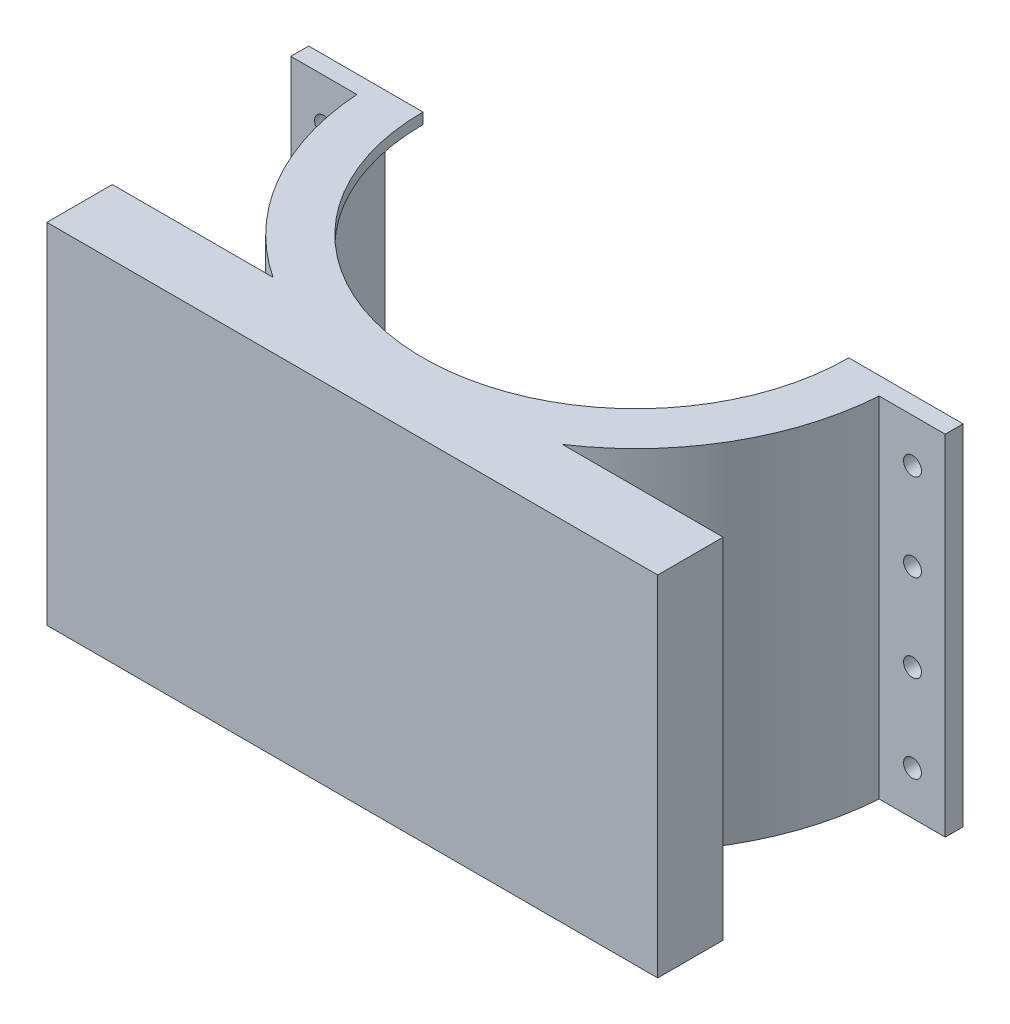
ISO-10303-21;
HEADER;
FILE_DESCRIPTION(('STEP AP214'),'2;1');
FILE_NAME('part.step','',(''),(''),'','','');
FILE_SCHEMA(('AUTOMOTIVE_DESIGN { 1 0 10303 214 1 1 1 1 }'));
ENDSEC;
DATA;
#1=APPLICATION_CONTEXT('core data for automotive mechanical design processes');
#2=APPLICATION_PROTOCOL_DEFINITION('international standard','automotive_design',2000,#1);
#3=PRODUCT_CONTEXT('',#1,'mechanical');
#4=PRODUCT('Part','Part','',(#3));
#5=PRODUCT_RELATED_PRODUCT_CATEGORY('part','',(#4));
#6=PRODUCT_DEFINITION_FORMATION('','',#4);
#7=PRODUCT_DEFINITION_CONTEXT('part definition',#1,'design');
#8=PRODUCT_DEFINITION('design','',#6,#7);
#9=PRODUCT_DEFINITION_SHAPE('','',#8);
#10=(LENGTH_UNIT() NAMED_UNIT(*) SI_UNIT(.MILLI.,.METRE.));
#11=(NAMED_UNIT(*) PLANE_ANGLE_UNIT() SI_UNIT($,.RADIAN.));
#12=(NAMED_UNIT(*) SI_UNIT($,.STERADIAN.) SOLID_ANGLE_UNIT());
#13=UNCERTAINTY_MEASURE_WITH_UNIT(LENGTH_MEASURE(1.E-05),#10,'distance_accuracy_value','');
#14=(GEOMETRIC_REPRESENTATION_CONTEXT(3) GLOBAL_UNCERTAINTY_ASSIGNED_CONTEXT((#13)) GLOBAL_UNIT_ASSIGNED_CONTEXT((#10,
#11,#12)) REPRESENTATION_CONTEXT('',''));
#15=CARTESIAN_POINT('',(0.,0.,0.));
#16=DIRECTION('',(0.,0.,1.));
#17=DIRECTION('',(1.,0.,0.));
#18=AXIS2_PLACEMENT_3D('',#15,#16,#17);
#19=CARTESIAN_POINT('',(0.,4.,0.));
#20=DIRECTION('',(0.,0.,-1.));
#21=DIRECTION('',(-1.,0.,0.));
#22=AXIS2_PLACEMENT_3D('',#19,#20,#21);
#23=PLANE('',#22);
#24=CARTESIAN_POINT('',(6.75,-3.,0.));
#25=DIRECTION('',(0.,0.,-1.));
#26=DIRECTION('',(-1.,0.,0.));
#27=AXIS2_PLACEMENT_3D('',#24,#25,#26);
#28=CIRCLE('',#27,0.205000000000001);
#29=CARTESIAN_POINT('',(6.545,-3.,0.));
#30=VERTEX_POINT('',#29);
#31=EDGE_CURVE('E176',#30,#30,#28,.T.);
#32=ORIENTED_EDGE('',*,*,#31,.F.);
#33=EDGE_LOOP('',(#32));
#34=FACE_BOUND('',#33,.T.);
#35=CARTESIAN_POINT('',(6.75,-0.999999999999998,0.));
#36=DIRECTION('',(0.,0.,-1.));
#37=DIRECTION('',(-1.,0.,0.));
#38=AXIS2_PLACEMENT_3D('',#35,#36,#37);
#39=CIRCLE('',#38,0.205000000000001);
#40=CARTESIAN_POINT('',(6.545,-0.999999999999998,0.));
#41=VERTEX_POINT('',#40);
#42=EDGE_CURVE('E359',#41,#41,#39,.T.);
#43=ORIENTED_EDGE('',*,*,#42,.F.);
#44=EDGE_LOOP('',(#43));
#45=FACE_BOUND('',#44,.T.);
#46=CARTESIAN_POINT('',(6.75,1.,0.));
#47=DIRECTION('',(0.,0.,-1.));
#48=DIRECTION('',(-1.,0.,0.));
#49=AXIS2_PLACEMENT_3D('',#46,#47,#48);
#50=CIRCLE('',#49,0.205000000000001);
#51=CARTESIAN_POINT('',(6.545,1.,0.));
#52=VERTEX_POINT('',#51);
#53=EDGE_CURVE('E362',#52,#52,#50,.T.);
#54=ORIENTED_EDGE('',*,*,#53,.F.);
#55=EDGE_LOOP('',(#54));
#56=FACE_BOUND('',#55,.T.);
#57=CARTESIAN_POINT('',(6.75,3.,0.));
#58=DIRECTION('',(0.,0.,-1.));
#59=DIRECTION('',(-1.,0.,0.));
#60=AXIS2_PLACEMENT_3D('',#57,#58,#59);
#61=CIRCLE('',#60,0.205000000000001);
#62=CARTESIAN_POINT('',(6.545,3.,0.));
#63=VERTEX_POINT('',#62);
#64=EDGE_CURVE('E365',#63,#63,#61,.T.);
#65=ORIENTED_EDGE('',*,*,#64,.F.);
#66=EDGE_LOOP('',(#65));
#67=FACE_BOUND('',#66,.T.);
#68=DIRECTION('',(1.,0.,0.));
#69=VECTOR('',#68,1.);
#70=CARTESIAN_POINT('',(0.,3.75,0.));
#71=LINE('',#70,#69);
#72=CARTESIAN_POINT('',(4.88,3.75,0.));
#73=VERTEX_POINT('',#72);
#74=CARTESIAN_POINT('',(5.75,3.75,0.));
#75=VERTEX_POINT('',#74);
#76=EDGE_CURVE('E175',#73,#75,#71,.T.);
#77=ORIENTED_EDGE('',*,*,#76,.F.);
#78=DIRECTION('',(0.,-1.,0.));
#79=VECTOR('',#78,1.);
#80=CARTESIAN_POINT('',(4.88,7.5,0.));
#81=LINE('',#80,#79);
#82=CARTESIAN_POINT('',(4.88,4.,0.));
#83=VERTEX_POINT('',#82);
#84=EDGE_CURVE('E51',#83,#73,#81,.T.);
#85=ORIENTED_EDGE('',*,*,#84,.F.);
#86=DIRECTION('',(1.,0.,0.));
#87=VECTOR('',#86,1.);
#88=CARTESIAN_POINT('',(0.,4.,0.));
#89=LINE('',#88,#87);
#90=CARTESIAN_POINT('',(7.5,4.,0.));
#91=VERTEX_POINT('',#90);
#92=EDGE_CURVE('E172',#83,#91,#89,.T.);
#93=ORIENTED_EDGE('',*,*,#92,.T.);
#94=DIRECTION('',(0.,-1.,0.));
#95=VECTOR('',#94,1.);
#96=CARTESIAN_POINT('',(7.5,4.,0.));
#97=LINE('',#96,#95);
#98=CARTESIAN_POINT('',(7.5,-4.,0.));
#99=VERTEX_POINT('',#98);
#100=EDGE_CURVE('E265',#91,#99,#97,.T.);
#101=ORIENTED_EDGE('',*,*,#100,.T.);
#102=DIRECTION('',(1.,0.,0.));
#103=VECTOR('',#102,1.);
#104=CARTESIAN_POINT('',(0.,-4.,0.));
#105=LINE('',#104,#103);
#106=CARTESIAN_POINT('',(1.5,-4.,0.));
#107=VERTEX_POINT('',#106);
#108=EDGE_CURVE('E218',#107,#99,#105,.T.);
#109=ORIENTED_EDGE('',*,*,#108,.F.);
#110=DIRECTION('',(0.,-1.,0.));
#111=VECTOR('',#110,1.);
#112=CARTESIAN_POINT('',(1.5,4.,0.));
#113=LINE('',#112,#111);
#114=CARTESIAN_POINT('',(1.5,-3.75,0.));
#115=VERTEX_POINT('',#114);
#116=EDGE_CURVE('E263',#115,#107,#113,.T.);
#117=ORIENTED_EDGE('',*,*,#116,.F.);
#118=DIRECTION('',(1.,0.,0.));
#119=VECTOR('',#118,1.);
#120=CARTESIAN_POINT('',(0.,-3.75,0.));
#121=LINE('',#120,#119);
#122=CARTESIAN_POINT('',(5.75,-3.75,0.));
#123=VERTEX_POINT('',#122);
#124=EDGE_CURVE('E344',#115,#123,#121,.T.);
#125=ORIENTED_EDGE('',*,*,#124,.T.);
#126=DIRECTION('',(0.,1.,0.));
#127=VECTOR('',#126,1.);
#128=CARTESIAN_POINT('',(5.75,-3.75,0.));
#129=LINE('',#128,#127);
#130=EDGE_CURVE('E209',#123,#75,#129,.T.);
#131=ORIENTED_EDGE('',*,*,#130,.T.);
#132=EDGE_LOOP('',(#77,#85,#93,#101,#109,#117,#125,#131));
#133=FACE_BOUND('',#132,.T.);
#134=ADVANCED_FACE('F37',(#34,#45,#56,#67,#133),#23,.T.);
#135=CARTESIAN_POINT('',(0.,4.,0.));
#136=DIRECTION('',(0.,0.,-1.));
#137=DIRECTION('',(-1.,0.,0.));
#138=AXIS2_PLACEMENT_3D('',#135,#136,#137);
#139=PLANE('',#138);
#140=CARTESIAN_POINT('',(-6.75,1.,0.));
#141=DIRECTION('',(0.,0.,-1.));
#142=DIRECTION('',(-1.,0.,0.));
#143=AXIS2_PLACEMENT_3D('',#140,#141,#142);
#144=CIRCLE('',#143,0.205000000000001);
#145=CARTESIAN_POINT('',(-6.955,1.,0.));
#146=VERTEX_POINT('',#145);
#147=EDGE_CURVE('E368',#146,#146,#144,.T.);
#148=ORIENTED_EDGE('',*,*,#147,.F.);
#149=EDGE_LOOP('',(#148));
#150=FACE_BOUND('',#149,.T.);
#151=CARTESIAN_POINT('',(-6.75,-1.,0.));
#152=DIRECTION('',(0.,0.,-1.));
#153=DIRECTION('',(-1.,0.,0.));
#154=AXIS2_PLACEMENT_3D('',#151,#152,#153);
#155=CIRCLE('',#154,0.205000000000001);
#156=CARTESIAN_POINT('',(-6.955,-1.,0.));
#157=VERTEX_POINT('',#156);
#158=EDGE_CURVE('E371',#157,#157,#155,.T.);
#159=ORIENTED_EDGE('',*,*,#158,.F.);
#160=EDGE_LOOP('',(#159));
#161=FACE_BOUND('',#160,.T.);
#162=CARTESIAN_POINT('',(-6.75,-3.,0.));
#163=DIRECTION('',(0.,0.,-1.));
#164=DIRECTION('',(-1.,0.,0.));
#165=AXIS2_PLACEMENT_3D('',#162,#163,#164);
#166=CIRCLE('',#165,0.205000000000001);
#167=CARTESIAN_POINT('',(-6.955,-3.,0.));
#168=VERTEX_POINT('',#167);
#169=EDGE_CURVE('E374',#168,#168,#166,.T.);
#170=ORIENTED_EDGE('',*,*,#169,.F.);
#171=EDGE_LOOP('',(#170));
#172=FACE_BOUND('',#171,.T.);
#173=CARTESIAN_POINT('',(-6.75,3.,0.));
#174=DIRECTION('',(0.,0.,-1.));
#175=DIRECTION('',(-1.,0.,0.));
#176=AXIS2_PLACEMENT_3D('',#173,#174,#175);
#177=CIRCLE('',#176,0.205000000000001);
#178=CARTESIAN_POINT('',(-6.955,3.,0.));
#179=VERTEX_POINT('',#178);
#180=EDGE_CURVE('E377',#179,#179,#177,.T.);
#181=ORIENTED_EDGE('',*,*,#180,.F.);
#182=EDGE_LOOP('',(#181));
#183=FACE_BOUND('',#182,.T.);
#184=DIRECTION('',(1.,0.,0.));
#185=VECTOR('',#184,1.);
#186=CARTESIAN_POINT('',(0.,4.,0.));
#187=LINE('',#186,#185);
#188=CARTESIAN_POINT('',(-7.5,4.,0.));
#189=VERTEX_POINT('',#188);
#190=CARTESIAN_POINT('',(-4.88,4.,0.));
#191=VERTEX_POINT('',#190);
#192=EDGE_CURVE('E182',#189,#191,#187,.T.);
#193=ORIENTED_EDGE('',*,*,#192,.T.);
#194=DIRECTION('',(0.,-1.,0.));
#195=VECTOR('',#194,1.);
#196=CARTESIAN_POINT('',(-4.88,7.5,0.));
#197=LINE('',#196,#195);
#198=CARTESIAN_POINT('',(-4.88,3.75,0.));
#199=VERTEX_POINT('',#198);
#200=EDGE_CURVE('E163',#191,#199,#197,.T.);
#201=ORIENTED_EDGE('',*,*,#200,.T.);
#202=DIRECTION('',(1.,0.,0.));
#203=VECTOR('',#202,1.);
#204=CARTESIAN_POINT('',(0.,3.75,0.));
#205=LINE('',#204,#203);
#206=CARTESIAN_POINT('',(-5.75,3.75,0.));
#207=VERTEX_POINT('',#206);
#208=EDGE_CURVE('E168',#207,#199,#205,.T.);
#209=ORIENTED_EDGE('',*,*,#208,.F.);
#210=DIRECTION('',(0.,1.,0.));
#211=VECTOR('',#210,1.);
#212=CARTESIAN_POINT('',(-5.75,-3.75,0.));
#213=LINE('',#212,#211);
#214=CARTESIAN_POINT('',(-5.75,-3.75,0.));
#215=VERTEX_POINT('',#214);
#216=EDGE_CURVE('E342',#215,#207,#213,.T.);
#217=ORIENTED_EDGE('',*,*,#216,.F.);
#218=DIRECTION('',(1.,0.,0.));
#219=VECTOR('',#218,1.);
#220=CARTESIAN_POINT('',(0.,-3.75,0.));
#221=LINE('',#220,#219);
#222=CARTESIAN_POINT('',(-1.5,-3.75,0.));
#223=VERTEX_POINT('',#222);
#224=EDGE_CURVE('E325',#215,#223,#221,.T.);
#225=ORIENTED_EDGE('',*,*,#224,.T.);
#226=DIRECTION('',(0.,-1.,0.));
#227=VECTOR('',#226,1.);
#228=CARTESIAN_POINT('',(-1.5,4.,0.));
#229=LINE('',#228,#227);
#230=CARTESIAN_POINT('',(-1.5,-4.,0.));
#231=VERTEX_POINT('',#230);
#232=EDGE_CURVE('E261',#223,#231,#229,.T.);
#233=ORIENTED_EDGE('',*,*,#232,.T.);
#234=DIRECTION('',(1.,0.,0.));
#235=VECTOR('',#234,1.);
#236=CARTESIAN_POINT('',(0.,-4.,0.));
#237=LINE('',#236,#235);
#238=CARTESIAN_POINT('',(-7.5,-4.,0.));
#239=VERTEX_POINT('',#238);
#240=EDGE_CURVE('E224',#239,#231,#237,.T.);
#241=ORIENTED_EDGE('',*,*,#240,.F.);
#242=DIRECTION('',(0.,-1.,0.));
#243=VECTOR('',#242,1.);
#244=CARTESIAN_POINT('',(-7.5,4.,0.));
#245=LINE('',#244,#243);
#246=EDGE_CURVE('E259',#189,#239,#245,.T.);
#247=ORIENTED_EDGE('',*,*,#246,.F.);
#248=EDGE_LOOP('',(#193,#201,#209,#217,#225,#233,#241,#247));
#249=FACE_BOUND('',#248,.T.);
#250=ADVANCED_FACE('F320',(#150,#161,#172,#183,#249),#139,.T.);
#251=CARTESIAN_POINT('',(0.,4.,0.));
#252=DIRECTION('',(0.,1.,0.));
#253=DIRECTION('',(0.,0.,1.));
#254=AXIS2_PLACEMENT_3D('',#251,#252,#253);
#255=PLANE('',#254);
#256=ORIENTED_EDGE('',*,*,#92,.F.);
#257=CARTESIAN_POINT('',(0.,4.,0.));
#258=DIRECTION('',(0.,1.,0.));
#259=DIRECTION('',(0.,0.,1.));
#260=AXIS2_PLACEMENT_3D('',#257,#258,#259);
#261=CIRCLE('',#260,4.88);
#262=EDGE_CURVE('E160',#83,#191,#261,.F.);
#263=ORIENTED_EDGE('',*,*,#262,.T.);
#264=ORIENTED_EDGE('',*,*,#192,.F.);
#265=DIRECTION('',(0.,0.,1.));
#266=VECTOR('',#265,1.);
#267=CARTESIAN_POINT('',(-7.5,4.,0.));
#268=LINE('',#267,#266);
#269=CARTESIAN_POINT('',(-7.5,4.,0.41));
#270=VERTEX_POINT('',#269);
#271=EDGE_CURVE('E184',#189,#270,#268,.T.);
#272=ORIENTED_EDGE('',*,*,#271,.T.);
#273=DIRECTION('',(1.,0.,0.));
#274=VECTOR('',#273,1.);
#275=CARTESIAN_POINT('',(0.,4.,0.41));
#276=LINE('',#275,#274);
#277=CARTESIAN_POINT('',(-5.98597527559211,4.,0.41));
#278=VERTEX_POINT('',#277);
#279=EDGE_CURVE('E191',#270,#278,#276,.T.);
#280=ORIENTED_EDGE('',*,*,#279,.T.);
#281=CARTESIAN_POINT('',(0.,4.,0.));
#282=DIRECTION('',(0.,1.,0.));
#283=DIRECTION('',(0.,0.,1.));
#284=AXIS2_PLACEMENT_3D('',#281,#282,#283);
#285=CIRCLE('',#284,6.);
#286=CARTESIAN_POINT('',(-3.3166247903554,4.,5.));
#287=VERTEX_POINT('',#286);
#288=EDGE_CURVE('E193',#278,#287,#285,.T.);
#289=ORIENTED_EDGE('',*,*,#288,.T.);
#290=DIRECTION('',(1.,0.,0.));
#291=VECTOR('',#290,1.);
#292=CARTESIAN_POINT('',(0.,4.,5.));
#293=LINE('',#292,#291);
#294=CARTESIAN_POINT('',(-7.,4.,5.));
#295=VERTEX_POINT('',#294);
#296=EDGE_CURVE('E194',#295,#287,#293,.T.);
#297=ORIENTED_EDGE('',*,*,#296,.F.);
#298=DIRECTION('',(0.,0.,1.));
#299=VECTOR('',#298,1.);
#300=CARTESIAN_POINT('',(-7.,4.,0.));
#301=LINE('',#300,#299);
#302=CARTESIAN_POINT('',(-7.,4.,6.5));
#303=VERTEX_POINT('',#302);
#304=EDGE_CURVE('E197',#295,#303,#301,.T.);
#305=ORIENTED_EDGE('',*,*,#304,.T.);
#306=DIRECTION('',(1.,0.,0.));
#307=VECTOR('',#306,1.);
#308=CARTESIAN_POINT('',(0.,4.,6.5));
#309=LINE('',#308,#307);
#310=CARTESIAN_POINT('',(7.,4.,6.5));
#311=VERTEX_POINT('',#310);
#312=EDGE_CURVE('E199',#303,#311,#309,.T.);
#313=ORIENTED_EDGE('',*,*,#312,.T.);
#314=DIRECTION('',(0.,0.,1.));
#315=VECTOR('',#314,1.);
#316=CARTESIAN_POINT('',(7.,4.,0.));
#317=LINE('',#316,#315);
#318=CARTESIAN_POINT('',(7.,4.,5.));
#319=VERTEX_POINT('',#318);
#320=EDGE_CURVE('E201',#319,#311,#317,.T.);
#321=ORIENTED_EDGE('',*,*,#320,.F.);
#322=DIRECTION('',(1.,0.,0.));
#323=VECTOR('',#322,1.);
#324=CARTESIAN_POINT('',(0.,4.,5.));
#325=LINE('',#324,#323);
#326=CARTESIAN_POINT('',(3.3166247903554,4.,5.));
#327=VERTEX_POINT('',#326);
#328=EDGE_CURVE('E242',#327,#319,#325,.T.);
#329=ORIENTED_EDGE('',*,*,#328,.F.);
#330=CARTESIAN_POINT('',(5.98597527559211,4.,0.41));
#331=VERTEX_POINT('',#330);
#332=EDGE_CURVE('E276',#327,#331,#285,.T.);
#333=ORIENTED_EDGE('',*,*,#332,.T.);
#334=DIRECTION('',(1.,0.,0.));
#335=VECTOR('',#334,1.);
#336=CARTESIAN_POINT('',(0.,4.,0.41));
#337=LINE('',#336,#335);
#338=CARTESIAN_POINT('',(7.5,4.,0.41));
#339=VERTEX_POINT('',#338);
#340=EDGE_CURVE('E186',#331,#339,#337,.T.);
#341=ORIENTED_EDGE('',*,*,#340,.T.);
#342=DIRECTION('',(0.,0.,1.));
#343=VECTOR('',#342,1.);
#344=CARTESIAN_POINT('',(7.5,4.,0.));
#345=LINE('',#344,#343);
#346=EDGE_CURVE('E181',#91,#339,#345,.T.);
#347=ORIENTED_EDGE('',*,*,#346,.F.);
#348=EDGE_LOOP('',(#256,#263,#264,#272,#280,#289,#297,#305,#313,#321,#329,#333,#341,#347));
#349=FACE_BOUND('',#348,.T.);
#350=ADVANCED_FACE('F179',(#349),#255,.T.);
#351=CARTESIAN_POINT('',(0.,3.75,0.));
#352=DIRECTION('',(0.,1.,0.));
#353=DIRECTION('',(0.,0.,1.));
#354=AXIS2_PLACEMENT_3D('',#351,#352,#353);
#355=PLANE('',#354);
#356=CARTESIAN_POINT('',(0.,3.75,0.));
#357=DIRECTION('',(0.,1.,0.));
#358=DIRECTION('',(0.,0.,1.));
#359=AXIS2_PLACEMENT_3D('',#356,#357,#358);
#360=CIRCLE('',#359,4.88);
#361=EDGE_CURVE('E11',#73,#199,#360,.F.);
#362=ORIENTED_EDGE('',*,*,#361,.F.);
#363=ORIENTED_EDGE('',*,*,#76,.T.);
#364=CARTESIAN_POINT('',(0.,3.75,0.));
#365=DIRECTION('',(0.,1.,0.));
#366=DIRECTION('',(0.,0.,1.));
#367=AXIS2_PLACEMENT_3D('',#364,#365,#366);
#368=CIRCLE('',#367,5.75);
#369=EDGE_CURVE('E59',#207,#75,#368,.T.);
#370=ORIENTED_EDGE('',*,*,#369,.F.);
#371=ORIENTED_EDGE('',*,*,#208,.T.);
#372=EDGE_LOOP('',(#362,#363,#370,#371));
#373=FACE_BOUND('',#372,.T.);
#374=ADVANCED_FACE('F467',(#373),#355,.F.);
#375=CARTESIAN_POINT('',(0.,4.,0.));
#376=DIRECTION('',(0.,-1.,0.));
#377=DIRECTION('',(0.,0.,-1.));
#378=AXIS2_PLACEMENT_3D('',#375,#376,#377);
#379=CYLINDRICAL_SURFACE('',#378,1.5);
#380=ORIENTED_EDGE('',*,*,#232,.F.);
#381=CARTESIAN_POINT('',(0.,-3.75,0.));
#382=DIRECTION('',(0.,1.,0.));
#383=DIRECTION('',(0.,0.,1.));
#384=AXIS2_PLACEMENT_3D('',#381,#382,#383);
#385=CIRCLE('',#384,1.5);
#386=EDGE_CURVE('E347',#223,#115,#385,.T.);
#387=ORIENTED_EDGE('',*,*,#386,.T.);
#388=ORIENTED_EDGE('',*,*,#116,.T.);
#389=CARTESIAN_POINT('',(0.,-4.,0.));
#390=DIRECTION('',(0.,1.,0.));
#391=DIRECTION('',(0.,0.,1.));
#392=AXIS2_PLACEMENT_3D('',#389,#390,#391);
#393=CIRCLE('',#392,1.5);
#394=EDGE_CURVE('E221',#231,#107,#393,.T.);
#395=ORIENTED_EDGE('',*,*,#394,.F.);
#396=EDGE_LOOP('',(#380,#387,#388,#395));
#397=FACE_BOUND('',#396,.T.);
#398=ADVANCED_FACE('F328',(#397),#379,.F.);
#399=CARTESIAN_POINT('',(0.,4.,5.));
#400=DIRECTION('',(0.,0.,-1.));
#401=DIRECTION('',(-1.,0.,0.));
#402=AXIS2_PLACEMENT_3D('',#399,#400,#401);
#403=PLANE('',#402);
#404=DIRECTION('',(1.,0.,0.));
#405=VECTOR('',#404,1.);
#406=CARTESIAN_POINT('',(0.,-4.,5.));
#407=LINE('',#406,#405);
#408=CARTESIAN_POINT('',(3.3166247903554,-4.,5.));
#409=VERTEX_POINT('',#408);
#410=CARTESIAN_POINT('',(7.,-4.,5.));
#411=VERTEX_POINT('',#410);
#412=EDGE_CURVE('E205',#409,#411,#407,.T.);
#413=ORIENTED_EDGE('',*,*,#412,.F.);
#414=DIRECTION('',(0.,-1.,0.));
#415=VECTOR('',#414,1.);
#416=CARTESIAN_POINT('',(3.3166247903554,4.,5.));
#417=LINE('',#416,#415);
#418=EDGE_CURVE('E45',#327,#409,#417,.T.);
#419=ORIENTED_EDGE('',*,*,#418,.F.);
#420=ORIENTED_EDGE('',*,*,#328,.T.);
#421=DIRECTION('',(0.,-1.,0.));
#422=VECTOR('',#421,1.);
#423=CARTESIAN_POINT('',(7.,4.,5.));
#424=LINE('',#423,#422);
#425=EDGE_CURVE('E204',#319,#411,#424,.T.);
#426=ORIENTED_EDGE('',*,*,#425,.T.);
#427=EDGE_LOOP('',(#413,#419,#420,#426));
#428=FACE_BOUND('',#427,.T.);
#429=ADVANCED_FACE('F39',(#428),#403,.T.);
#430=CARTESIAN_POINT('',(0.,4.,0.));
#431=DIRECTION('',(0.,-1.,0.));
#432=DIRECTION('',(0.,0.,-1.));
#433=AXIS2_PLACEMENT_3D('',#430,#431,#432);
#434=CYLINDRICAL_SURFACE('',#433,6.);
#435=CARTESIAN_POINT('',(0.,-4.,0.));
#436=DIRECTION('',(0.,1.,0.));
#437=DIRECTION('',(0.,0.,1.));
#438=AXIS2_PLACEMENT_3D('',#435,#436,#437);
#439=CIRCLE('',#438,6.);
#440=CARTESIAN_POINT('',(5.98597527559211,-4.,0.41));
#441=VERTEX_POINT('',#440);
#442=EDGE_CURVE('E208',#409,#441,#439,.T.);
#443=ORIENTED_EDGE('',*,*,#442,.T.);
#444=DIRECTION('',(0.,-1.,0.));
#445=VECTOR('',#444,1.);
#446=CARTESIAN_POINT('',(5.98597527559211,4.,0.41));
#447=LINE('',#446,#445);
#448=EDGE_CURVE('E269',#331,#441,#447,.T.);
#449=ORIENTED_EDGE('',*,*,#448,.F.);
#450=ORIENTED_EDGE('',*,*,#332,.F.);
#451=ORIENTED_EDGE('',*,*,#418,.T.);
#452=EDGE_LOOP('',(#443,#449,#450,#451));
#453=FACE_BOUND('',#452,.T.);
#454=ADVANCED_FACE('F274',(#453),#434,.T.);
#455=CARTESIAN_POINT('',(0.,4.,0.41));
#456=DIRECTION('',(0.,0.,-1.));
#457=DIRECTION('',(-1.,0.,0.));
#458=AXIS2_PLACEMENT_3D('',#455,#456,#457);
#459=PLANE('',#458);
#460=CARTESIAN_POINT('',(6.75,-3.,0.41));
#461=DIRECTION('',(0.,0.,1.));
#462=DIRECTION('',(1.,0.,0.));
#463=AXIS2_PLACEMENT_3D('',#460,#461,#462);
#464=CIRCLE('',#463,0.205000000000001);
#465=CARTESIAN_POINT('',(6.955,-3.,0.41));
#466=VERTEX_POINT('',#465);
#467=EDGE_CURVE('E384',#466,#466,#464,.T.);
#468=ORIENTED_EDGE('',*,*,#467,.F.);
#469=EDGE_LOOP('',(#468));
#470=FACE_BOUND('',#469,.T.);
#471=CARTESIAN_POINT('',(6.75,-0.999999999999998,0.41));
#472=DIRECTION('',(0.,0.,1.));
#473=DIRECTION('',(1.,0.,0.));
#474=AXIS2_PLACEMENT_3D('',#471,#472,#473);
#475=CIRCLE('',#474,0.205000000000001);
#476=CARTESIAN_POINT('',(6.955,-0.999999999999998,0.41));
#477=VERTEX_POINT('',#476);
#478=EDGE_CURVE('E388',#477,#477,#475,.T.);
#479=ORIENTED_EDGE('',*,*,#478,.F.);
#480=EDGE_LOOP('',(#479));
#481=FACE_BOUND('',#480,.T.);
#482=CARTESIAN_POINT('',(6.75,1.,0.41));
#483=DIRECTION('',(0.,0.,1.));
#484=DIRECTION('',(-1.,0.,0.));
#485=AXIS2_PLACEMENT_3D('',#482,#483,#484);
#486=CIRCLE('',#485,0.205000000000001);
#487=CARTESIAN_POINT('',(6.545,1.,0.41));
#488=VERTEX_POINT('',#487);
#489=EDGE_CURVE('E399',#488,#488,#486,.T.);
#490=ORIENTED_EDGE('',*,*,#489,.F.);
#491=EDGE_LOOP('',(#490));
#492=FACE_BOUND('',#491,.T.);
#493=CARTESIAN_POINT('',(6.75,3.,0.41));
#494=DIRECTION('',(0.,0.,1.));
#495=DIRECTION('',(-1.,0.,0.));
#496=AXIS2_PLACEMENT_3D('',#493,#494,#495);
#497=CIRCLE('',#496,0.205000000000001);
#498=CARTESIAN_POINT('',(6.545,3.,0.41));
#499=VERTEX_POINT('',#498);
#500=EDGE_CURVE('E396',#499,#499,#497,.T.);
#501=ORIENTED_EDGE('',*,*,#500,.F.);
#502=EDGE_LOOP('',(#501));
#503=FACE_BOUND('',#502,.T.);
#504=DIRECTION('',(1.,0.,0.));
#505=VECTOR('',#504,1.);
#506=CARTESIAN_POINT('',(0.,-4.,0.41));
#507=LINE('',#506,#505);
#508=CARTESIAN_POINT('',(7.5,-4.,0.41));
#509=VERTEX_POINT('',#508);
#510=EDGE_CURVE('E211',#441,#509,#507,.T.);
#511=ORIENTED_EDGE('',*,*,#510,.T.);
#512=DIRECTION('',(0.,-1.,0.));
#513=VECTOR('',#512,1.);
#514=CARTESIAN_POINT('',(7.5,4.,0.41));
#515=LINE('',#514,#513);
#516=EDGE_CURVE('E267',#339,#509,#515,.T.);
#517=ORIENTED_EDGE('',*,*,#516,.F.);
#518=ORIENTED_EDGE('',*,*,#340,.F.);
#519=ORIENTED_EDGE('',*,*,#448,.T.);
#520=EDGE_LOOP('',(#511,#517,#518,#519));
#521=FACE_BOUND('',#520,.T.);
#522=ADVANCED_FACE('F338',(#470,#481,#492,#503,#521),#459,.F.);
#523=CARTESIAN_POINT('',(7.5,4.,0.));
#524=DIRECTION('',(1.,0.,0.));
#525=DIRECTION('',(0.,0.,-1.));
#526=AXIS2_PLACEMENT_3D('',#523,#524,#525);
#527=PLANE('',#526);
#528=DIRECTION('',(0.,0.,1.));
#529=VECTOR('',#528,1.);
#530=CARTESIAN_POINT('',(7.5,-4.,0.));
#531=LINE('',#530,#529);
#532=EDGE_CURVE('E215',#99,#509,#531,.T.);
#533=ORIENTED_EDGE('',*,*,#532,.F.);
#534=ORIENTED_EDGE('',*,*,#100,.F.);
#535=ORIENTED_EDGE('',*,*,#346,.T.);
#536=ORIENTED_EDGE('',*,*,#516,.T.);
#537=EDGE_LOOP('',(#533,#534,#535,#536));
#538=FACE_BOUND('',#537,.T.);
#539=ADVANCED_FACE('F334',(#538),#527,.T.);
#540=CARTESIAN_POINT('',(-7.5,4.,0.));
#541=DIRECTION('',(1.,0.,0.));
#542=DIRECTION('',(0.,0.,-1.));
#543=AXIS2_PLACEMENT_3D('',#540,#541,#542);
#544=PLANE('',#543);
#545=DIRECTION('',(0.,0.,1.));
#546=VECTOR('',#545,1.);
#547=CARTESIAN_POINT('',(-7.5,-4.,0.));
#548=LINE('',#547,#546);
#549=CARTESIAN_POINT('',(-7.5,-4.,0.41));
#550=VERTEX_POINT('',#549);
#551=EDGE_CURVE('E227',#239,#550,#548,.T.);
#552=ORIENTED_EDGE('',*,*,#551,.T.);
#553=DIRECTION('',(0.,-1.,0.));
#554=VECTOR('',#553,1.);
#555=CARTESIAN_POINT('',(-7.5,4.,0.41));
#556=LINE('',#555,#554);
#557=EDGE_CURVE('E256',#270,#550,#556,.T.);
#558=ORIENTED_EDGE('',*,*,#557,.F.);
#559=ORIENTED_EDGE('',*,*,#271,.F.);
#560=ORIENTED_EDGE('',*,*,#246,.T.);
#561=EDGE_LOOP('',(#552,#558,#559,#560));
#562=FACE_BOUND('',#561,.T.);
#563=ADVANCED_FACE('F317',(#562),#544,.F.);
#564=CARTESIAN_POINT('',(0.,4.,0.41));
#565=DIRECTION('',(0.,0.,-1.));
#566=DIRECTION('',(-1.,0.,0.));
#567=AXIS2_PLACEMENT_3D('',#564,#565,#566);
#568=PLANE('',#567);
#569=CARTESIAN_POINT('',(-6.75,1.,0.41));
#570=DIRECTION('',(0.,0.,1.));
#571=DIRECTION('',(1.,0.,0.));
#572=AXIS2_PLACEMENT_3D('',#569,#570,#571);
#573=CIRCLE('',#572,0.205000000000001);
#574=CARTESIAN_POINT('',(-6.545,1.,0.41));
#575=VERTEX_POINT('',#574);
#576=EDGE_CURVE('E383',#575,#575,#573,.T.);
#577=ORIENTED_EDGE('',*,*,#576,.F.);
#578=EDGE_LOOP('',(#577));
#579=FACE_BOUND('',#578,.T.);
#580=CARTESIAN_POINT('',(-6.75,-1.,0.41));
#581=DIRECTION('',(0.,0.,1.));
#582=DIRECTION('',(-1.,0.,0.));
#583=AXIS2_PLACEMENT_3D('',#580,#581,#582);
#584=CIRCLE('',#583,0.205000000000001);
#585=CARTESIAN_POINT('',(-6.955,-1.,0.41));
#586=VERTEX_POINT('',#585);
#587=EDGE_CURVE('E391',#586,#586,#584,.T.);
#588=ORIENTED_EDGE('',*,*,#587,.F.);
#589=EDGE_LOOP('',(#588));
#590=FACE_BOUND('',#589,.T.);
#591=CARTESIAN_POINT('',(-6.75,-3.,0.41));
#592=DIRECTION('',(0.,0.,1.));
#593=DIRECTION('',(-1.,0.,0.));
#594=AXIS2_PLACEMENT_3D('',#591,#592,#593);
#595=CIRCLE('',#594,0.205000000000001);
#596=CARTESIAN_POINT('',(-6.955,-3.,0.41));
#597=VERTEX_POINT('',#596);
#598=EDGE_CURVE('E387',#597,#597,#595,.T.);
#599=ORIENTED_EDGE('',*,*,#598,.F.);
#600=EDGE_LOOP('',(#599));
#601=FACE_BOUND('',#600,.T.);
#602=CARTESIAN_POINT('',(-6.75,3.,0.41));
#603=DIRECTION('',(0.,0.,1.));
#604=DIRECTION('',(1.,0.,0.));
#605=AXIS2_PLACEMENT_3D('',#602,#603,#604);
#606=CIRCLE('',#605,0.205000000000001);
#607=CARTESIAN_POINT('',(-6.545,3.,0.41));
#608=VERTEX_POINT('',#607);
#609=EDGE_CURVE('E380',#608,#608,#606,.T.);
#610=ORIENTED_EDGE('',*,*,#609,.F.);
#611=EDGE_LOOP('',(#610));
#612=FACE_BOUND('',#611,.T.);
#613=DIRECTION('',(1.,0.,0.));
#614=VECTOR('',#613,1.);
#615=CARTESIAN_POINT('',(0.,-4.,0.41));
#616=LINE('',#615,#614);
#617=CARTESIAN_POINT('',(-5.98597527559211,-4.,0.41));
#618=VERTEX_POINT('',#617);
#619=EDGE_CURVE('E229',#550,#618,#616,.T.);
#620=ORIENTED_EDGE('',*,*,#619,.T.);
#621=DIRECTION('',(0.,-1.,0.));
#622=VECTOR('',#621,1.);
#623=CARTESIAN_POINT('',(-5.98597527559211,4.,0.41));
#624=LINE('',#623,#622);
#625=EDGE_CURVE('E253',#278,#618,#624,.T.);
#626=ORIENTED_EDGE('',*,*,#625,.F.);
#627=ORIENTED_EDGE('',*,*,#279,.F.);
#628=ORIENTED_EDGE('',*,*,#557,.T.);
#629=EDGE_LOOP('',(#620,#626,#627,#628));
#630=FACE_BOUND('',#629,.T.);
#631=ADVANCED_FACE('F313',(#579,#590,#601,#612,#630),#568,.F.);
#632=CARTESIAN_POINT('',(-3.3166247903554,-4.,5.));
#633=VERTEX_POINT('',#632);
#634=EDGE_CURVE('E212',#618,#633,#439,.T.);
#635=ORIENTED_EDGE('',*,*,#634,.T.);
#636=DIRECTION('',(0.,-1.,0.));
#637=VECTOR('',#636,1.);
#638=CARTESIAN_POINT('',(-3.3166247903554,4.,5.));
#639=LINE('',#638,#637);
#640=EDGE_CURVE('E251',#287,#633,#639,.T.);
#641=ORIENTED_EDGE('',*,*,#640,.F.);
#642=ORIENTED_EDGE('',*,*,#288,.F.);
#643=ORIENTED_EDGE('',*,*,#625,.T.);
#644=EDGE_LOOP('',(#635,#641,#642,#643));
#645=FACE_BOUND('',#644,.T.);
#646=ADVANCED_FACE('F308',(#645),#434,.T.);
#647=CARTESIAN_POINT('',(0.,4.,5.));
#648=DIRECTION('',(0.,0.,-1.));
#649=DIRECTION('',(-1.,0.,0.));
#650=AXIS2_PLACEMENT_3D('',#647,#648,#649);
#651=PLANE('',#650);
#652=DIRECTION('',(1.,0.,0.));
#653=VECTOR('',#652,1.);
#654=CARTESIAN_POINT('',(0.,-4.,5.));
#655=LINE('',#654,#653);
#656=CARTESIAN_POINT('',(-7.,-4.,5.));
#657=VERTEX_POINT('',#656);
#658=EDGE_CURVE('E231',#657,#633,#655,.T.);
#659=ORIENTED_EDGE('',*,*,#658,.F.);
#660=DIRECTION('',(0.,-1.,0.));
#661=VECTOR('',#660,1.);
#662=CARTESIAN_POINT('',(-7.,4.,5.));
#663=LINE('',#662,#661);
#664=EDGE_CURVE('E249',#295,#657,#663,.T.);
#665=ORIENTED_EDGE('',*,*,#664,.F.);
#666=ORIENTED_EDGE('',*,*,#296,.T.);
#667=ORIENTED_EDGE('',*,*,#640,.T.);
#668=EDGE_LOOP('',(#659,#665,#666,#667));
#669=FACE_BOUND('',#668,.T.);
#670=ADVANCED_FACE('F301',(#669),#651,.T.);
#671=CARTESIAN_POINT('',(-7.,4.,0.));
#672=DIRECTION('',(1.,0.,0.));
#673=DIRECTION('',(0.,0.,-1.));
#674=AXIS2_PLACEMENT_3D('',#671,#672,#673);
#675=PLANE('',#674);
#676=DIRECTION('',(0.,0.,1.));
#677=VECTOR('',#676,1.);
#678=CARTESIAN_POINT('',(-7.,-4.,0.));
#679=LINE('',#678,#677);
#680=CARTESIAN_POINT('',(-7.,-4.,6.5));
#681=VERTEX_POINT('',#680);
#682=EDGE_CURVE('E234',#657,#681,#679,.T.);
#683=ORIENTED_EDGE('',*,*,#682,.T.);
#684=DIRECTION('',(0.,-1.,0.));
#685=VECTOR('',#684,1.);
#686=CARTESIAN_POINT('',(-7.,4.,6.5));
#687=LINE('',#686,#685);
#688=EDGE_CURVE('E246',#303,#681,#687,.T.);
#689=ORIENTED_EDGE('',*,*,#688,.F.);
#690=ORIENTED_EDGE('',*,*,#304,.F.);
#691=ORIENTED_EDGE('',*,*,#664,.T.);
#692=EDGE_LOOP('',(#683,#689,#690,#691));
#693=FACE_BOUND('',#692,.T.);
#694=ADVANCED_FACE('F298',(#693),#675,.F.);
#695=CARTESIAN_POINT('',(0.,4.,6.5));
#696=DIRECTION('',(0.,0.,-1.));
#697=DIRECTION('',(-1.,0.,0.));
#698=AXIS2_PLACEMENT_3D('',#695,#696,#697);
#699=PLANE('',#698);
#700=DIRECTION('',(1.,0.,0.));
#701=VECTOR('',#700,1.);
#702=CARTESIAN_POINT('',(0.,-4.,6.5));
#703=LINE('',#702,#701);
#704=CARTESIAN_POINT('',(7.,-4.,6.5));
#705=VERTEX_POINT('',#704);
#706=EDGE_CURVE('E236',#681,#705,#703,.T.);
#707=ORIENTED_EDGE('',*,*,#706,.T.);
#708=DIRECTION('',(0.,-1.,0.));
#709=VECTOR('',#708,1.);
#710=CARTESIAN_POINT('',(7.,4.,6.5));
#711=LINE('',#710,#709);
#712=EDGE_CURVE('E244',#311,#705,#711,.T.);
#713=ORIENTED_EDGE('',*,*,#712,.F.);
#714=ORIENTED_EDGE('',*,*,#312,.F.);
#715=ORIENTED_EDGE('',*,*,#688,.T.);
#716=EDGE_LOOP('',(#707,#713,#714,#715));
#717=FACE_BOUND('',#716,.T.);
#718=ADVANCED_FACE('F293',(#717),#699,.F.);
#719=CARTESIAN_POINT('',(7.,4.,0.));
#720=DIRECTION('',(1.,0.,0.));
#721=DIRECTION('',(0.,0.,-1.));
#722=AXIS2_PLACEMENT_3D('',#719,#720,#721);
#723=PLANE('',#722);
#724=DIRECTION('',(0.,0.,1.));
#725=VECTOR('',#724,1.);
#726=CARTESIAN_POINT('',(7.,-4.,0.));
#727=LINE('',#726,#725);
#728=EDGE_CURVE('E239',#411,#705,#727,.T.);
#729=ORIENTED_EDGE('',*,*,#728,.F.);
#730=ORIENTED_EDGE('',*,*,#425,.F.);
#731=ORIENTED_EDGE('',*,*,#320,.T.);
#732=ORIENTED_EDGE('',*,*,#712,.T.);
#733=EDGE_LOOP('',(#729,#730,#731,#732));
#734=FACE_BOUND('',#733,.T.);
#735=ADVANCED_FACE('F287',(#734),#723,.T.);
#736=CARTESIAN_POINT('',(0.,-4.,0.));
#737=DIRECTION('',(0.,1.,0.));
#738=DIRECTION('',(0.,0.,1.));
#739=AXIS2_PLACEMENT_3D('',#736,#737,#738);
#740=PLANE('',#739);
#741=ORIENTED_EDGE('',*,*,#412,.T.);
#742=ORIENTED_EDGE('',*,*,#728,.T.);
#743=ORIENTED_EDGE('',*,*,#706,.F.);
#744=ORIENTED_EDGE('',*,*,#682,.F.);
#745=ORIENTED_EDGE('',*,*,#658,.T.);
#746=ORIENTED_EDGE('',*,*,#634,.F.);
#747=ORIENTED_EDGE('',*,*,#619,.F.);
#748=ORIENTED_EDGE('',*,*,#551,.F.);
#749=ORIENTED_EDGE('',*,*,#240,.T.);
#750=ORIENTED_EDGE('',*,*,#394,.T.);
#751=ORIENTED_EDGE('',*,*,#108,.T.);
#752=ORIENTED_EDGE('',*,*,#532,.T.);
#753=ORIENTED_EDGE('',*,*,#510,.F.);
#754=ORIENTED_EDGE('',*,*,#442,.F.);
#755=EDGE_LOOP('',(#741,#742,#743,#744,#745,#746,#747,#748,#749,#750,#751,#752,#753,#754));
#756=FACE_BOUND('',#755,.T.);
#757=ADVANCED_FACE('F283',(#756),#740,.F.);
#758=CARTESIAN_POINT('',(0.,-3.75,0.));
#759=DIRECTION('',(0.,1.,0.));
#760=DIRECTION('',(0.,0.,1.));
#761=AXIS2_PLACEMENT_3D('',#758,#759,#760);
#762=CYLINDRICAL_SURFACE('',#761,5.75);
#763=ORIENTED_EDGE('',*,*,#369,.T.);
#764=ORIENTED_EDGE('',*,*,#130,.F.);
#765=CARTESIAN_POINT('',(0.,-3.75,0.));
#766=DIRECTION('',(0.,1.,0.));
#767=DIRECTION('',(0.,0.,1.));
#768=AXIS2_PLACEMENT_3D('',#765,#766,#767);
#769=CIRCLE('',#768,5.75);
#770=EDGE_CURVE('E351',#215,#123,#769,.T.);
#771=ORIENTED_EDGE('',*,*,#770,.F.);
#772=ORIENTED_EDGE('',*,*,#216,.T.);
#773=EDGE_LOOP('',(#763,#764,#771,#772));
#774=FACE_BOUND('',#773,.T.);
#775=ADVANCED_FACE('F464',(#774),#762,.F.);
#776=CARTESIAN_POINT('',(0.,-3.75,0.));
#777=DIRECTION('',(0.,1.,0.));
#778=DIRECTION('',(0.,0.,1.));
#779=AXIS2_PLACEMENT_3D('',#776,#777,#778);
#780=PLANE('',#779);
#781=ORIENTED_EDGE('',*,*,#386,.F.);
#782=ORIENTED_EDGE('',*,*,#224,.F.);
#783=ORIENTED_EDGE('',*,*,#770,.T.);
#784=ORIENTED_EDGE('',*,*,#124,.F.);
#785=EDGE_LOOP('',(#781,#782,#783,#784));
#786=FACE_BOUND('',#785,.T.);
#787=ADVANCED_FACE('F470',(#786),#780,.T.);
#788=CARTESIAN_POINT('',(0.,7.5,0.));
#789=DIRECTION('',(0.,-1.,0.));
#790=DIRECTION('',(0.,0.,-1.));
#791=AXIS2_PLACEMENT_3D('',#788,#789,#790);
#792=CYLINDRICAL_SURFACE('',#791,4.88);
#793=ORIENTED_EDGE('',*,*,#84,.T.);
#794=ORIENTED_EDGE('',*,*,#361,.T.);
#795=ORIENTED_EDGE('',*,*,#200,.F.);
#796=ORIENTED_EDGE('',*,*,#262,.F.);
#797=EDGE_LOOP('',(#793,#794,#795,#796));
#798=FACE_BOUND('',#797,.T.);
#799=ADVANCED_FACE('F161',(#798),#792,.F.);
#800=CARTESIAN_POINT('',(-6.75,3.,-7.09));
#801=DIRECTION('',(0.,0.,1.));
#802=DIRECTION('',(1.,0.,0.));
#803=AXIS2_PLACEMENT_3D('',#800,#801,#802);
#804=CYLINDRICAL_SURFACE('',#803,0.205000000000001);
#805=ORIENTED_EDGE('',*,*,#180,.T.);
#806=EDGE_LOOP('',(#805));
#807=FACE_BOUND('',#806,.T.);
#808=ORIENTED_EDGE('',*,*,#609,.T.);
#809=EDGE_LOOP('',(#808));
#810=FACE_BOUND('',#809,.T.);
#811=ADVANCED_FACE('F479',(#807,#810),#804,.F.);
#812=CARTESIAN_POINT('',(-6.75,-3.,-7.09));
#813=DIRECTION('',(0.,0.,1.));
#814=DIRECTION('',(1.,0.,0.));
#815=AXIS2_PLACEMENT_3D('',#812,#813,#814);
#816=CYLINDRICAL_SURFACE('',#815,0.205000000000001);
#817=ORIENTED_EDGE('',*,*,#169,.T.);
#818=EDGE_LOOP('',(#817));
#819=FACE_BOUND('',#818,.T.);
#820=ORIENTED_EDGE('',*,*,#598,.T.);
#821=EDGE_LOOP('',(#820));
#822=FACE_BOUND('',#821,.T.);
#823=ADVANCED_FACE('F482',(#819,#822),#816,.F.);
#824=CARTESIAN_POINT('',(-6.75,-1.,-7.09));
#825=DIRECTION('',(0.,0.,1.));
#826=DIRECTION('',(1.,0.,0.));
#827=AXIS2_PLACEMENT_3D('',#824,#825,#826);
#828=CYLINDRICAL_SURFACE('',#827,0.205000000000001);
#829=ORIENTED_EDGE('',*,*,#158,.T.);
#830=EDGE_LOOP('',(#829));
#831=FACE_BOUND('',#830,.T.);
#832=ORIENTED_EDGE('',*,*,#587,.T.);
#833=EDGE_LOOP('',(#832));
#834=FACE_BOUND('',#833,.T.);
#835=ADVANCED_FACE('F426',(#831,#834),#828,.F.);
#836=CARTESIAN_POINT('',(-6.75,1.,-7.09));
#837=DIRECTION('',(0.,0.,1.));
#838=DIRECTION('',(1.,0.,0.));
#839=AXIS2_PLACEMENT_3D('',#836,#837,#838);
#840=CYLINDRICAL_SURFACE('',#839,0.205000000000001);
#841=ORIENTED_EDGE('',*,*,#147,.T.);
#842=EDGE_LOOP('',(#841));
#843=FACE_BOUND('',#842,.T.);
#844=ORIENTED_EDGE('',*,*,#576,.T.);
#845=EDGE_LOOP('',(#844));
#846=FACE_BOUND('',#845,.T.);
#847=ADVANCED_FACE('F417',(#843,#846),#840,.F.);
#848=CARTESIAN_POINT('',(6.75,3.,-7.09));
#849=DIRECTION('',(0.,0.,1.));
#850=DIRECTION('',(1.,0.,0.));
#851=AXIS2_PLACEMENT_3D('',#848,#849,#850);
#852=CYLINDRICAL_SURFACE('',#851,0.205000000000001);
#853=ORIENTED_EDGE('',*,*,#64,.T.);
#854=EDGE_LOOP('',(#853));
#855=FACE_BOUND('',#854,.T.);
#856=ORIENTED_EDGE('',*,*,#500,.T.);
#857=EDGE_LOOP('',(#856));
#858=FACE_BOUND('',#857,.T.);
#859=ADVANCED_FACE('F414',(#855,#858),#852,.F.);
#860=CARTESIAN_POINT('',(6.75,1.,-7.09));
#861=DIRECTION('',(0.,0.,1.));
#862=DIRECTION('',(1.,0.,0.));
#863=AXIS2_PLACEMENT_3D('',#860,#861,#862);
#864=CYLINDRICAL_SURFACE('',#863,0.205000000000001);
#865=ORIENTED_EDGE('',*,*,#53,.T.);
#866=EDGE_LOOP('',(#865));
#867=FACE_BOUND('',#866,.T.);
#868=ORIENTED_EDGE('',*,*,#489,.T.);
#869=EDGE_LOOP('',(#868));
#870=FACE_BOUND('',#869,.T.);
#871=ADVANCED_FACE('F416',(#867,#870),#864,.F.);
#872=CARTESIAN_POINT('',(6.75,-0.999999999999998,-7.09));
#873=DIRECTION('',(0.,0.,1.));
#874=DIRECTION('',(1.,0.,0.));
#875=AXIS2_PLACEMENT_3D('',#872,#873,#874);
#876=CYLINDRICAL_SURFACE('',#875,0.205000000000001);
#877=ORIENTED_EDGE('',*,*,#42,.T.);
#878=EDGE_LOOP('',(#877));
#879=FACE_BOUND('',#878,.T.);
#880=ORIENTED_EDGE('',*,*,#478,.T.);
#881=EDGE_LOOP('',(#880));
#882=FACE_BOUND('',#881,.T.);
#883=ADVANCED_FACE('F405',(#879,#882),#876,.F.);
#884=CARTESIAN_POINT('',(6.75,-3.,-7.09));
#885=DIRECTION('',(0.,0.,1.));
#886=DIRECTION('',(1.,0.,0.));
#887=AXIS2_PLACEMENT_3D('',#884,#885,#886);
#888=CYLINDRICAL_SURFACE('',#887,0.205000000000001);
#889=ORIENTED_EDGE('',*,*,#31,.T.);
#890=EDGE_LOOP('',(#889));
#891=FACE_BOUND('',#890,.T.);
#892=ORIENTED_EDGE('',*,*,#467,.T.);
#893=EDGE_LOOP('',(#892));
#894=FACE_BOUND('',#893,.T.);
#895=ADVANCED_FACE('F484',(#891,#894),#888,.F.);
#896=CLOSED_SHELL('',(#134,#250,#350,#374,#398,#429,#454,#522,#539,#563,#631,#646,#670,#694,
#718,#735,#757,#775,#787,#799,#811,#823,#835,#847,#859,#871,#883,#895));
#897=MANIFOLD_SOLID_BREP('B2',#896);
#898=ADVANCED_BREP_SHAPE_REPRESENTATION('',(#18,#897),#14);
#899=SHAPE_DEFINITION_REPRESENTATION(#9,#898);
ENDSEC;
END-ISO-10303-21;
